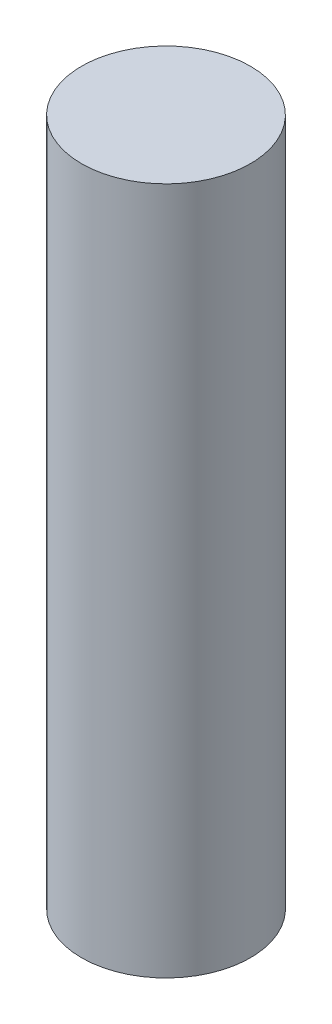
ISO-10303-21;
HEADER;
FILE_DESCRIPTION(('STEP AP214'),'2;1');
FILE_NAME('part.step','',(''),(''),'','','');
FILE_SCHEMA(('AUTOMOTIVE_DESIGN { 1 0 10303 214 1 1 1 1 }'));
ENDSEC;
DATA;
#1=APPLICATION_CONTEXT('core data for automotive mechanical design processes');
#2=APPLICATION_PROTOCOL_DEFINITION('international standard','automotive_design',2000,#1);
#3=PRODUCT_CONTEXT('',#1,'mechanical');
#4=PRODUCT('Part','Part','',(#3));
#5=PRODUCT_RELATED_PRODUCT_CATEGORY('part','',(#4));
#6=PRODUCT_DEFINITION_FORMATION('','',#4);
#7=PRODUCT_DEFINITION_CONTEXT('part definition',#1,'design');
#8=PRODUCT_DEFINITION('design','',#6,#7);
#9=PRODUCT_DEFINITION_SHAPE('','',#8);
#10=(LENGTH_UNIT() NAMED_UNIT(*) SI_UNIT(.MILLI.,.METRE.));
#11=(NAMED_UNIT(*) PLANE_ANGLE_UNIT() SI_UNIT($,.RADIAN.));
#12=(NAMED_UNIT(*) SI_UNIT($,.STERADIAN.) SOLID_ANGLE_UNIT());
#13=UNCERTAINTY_MEASURE_WITH_UNIT(LENGTH_MEASURE(1.E-05),#10,'distance_accuracy_value','');
#14=(GEOMETRIC_REPRESENTATION_CONTEXT(3) GLOBAL_UNCERTAINTY_ASSIGNED_CONTEXT((#13)) GLOBAL_UNIT_ASSIGNED_CONTEXT((#10,
#11,#12)) REPRESENTATION_CONTEXT('',''));
#15=CARTESIAN_POINT('',(0.,0.,0.));
#16=DIRECTION('',(0.,0.,1.));
#17=DIRECTION('',(1.,0.,0.));
#18=AXIS2_PLACEMENT_3D('',#15,#16,#17);
#19=CARTESIAN_POINT('',(-139.999999999997,-107.5,1687.5));
#20=DIRECTION('',(0.,-1.,0.));
#21=DIRECTION('',(0.,0.,-1.));
#22=AXIS2_PLACEMENT_3D('',#19,#20,#21);
#23=PLANE('',#22);
#24=CARTESIAN_POINT('',(-139.999999999997,-107.5,1687.5));
#25=DIRECTION('',(0.,-1.,0.));
#26=DIRECTION('',(0.,0.,-1.));
#27=AXIS2_PLACEMENT_3D('',#24,#25,#26);
#28=CIRCLE('',#27,17.5);
#29=CARTESIAN_POINT('',(-139.999999999997,-107.5,1670.));
#30=VERTEX_POINT('',#29);
#31=EDGE_CURVE('E18',#30,#30,#28,.F.);
#32=ORIENTED_EDGE('',*,*,#31,.F.);
#33=EDGE_LOOP('',(#32));
#34=FACE_BOUND('',#33,.T.);
#35=ADVANCED_FACE('F15',(#34),#23,.T.);
#36=CARTESIAN_POINT('',(-244.51322816025,35.,1798.));
#37=DIRECTION('',(0.,1.,0.));
#38=DIRECTION('',(0.,0.,1.));
#39=AXIS2_PLACEMENT_3D('',#36,#37,#38);
#40=PLANE('',#39);
#41=CARTESIAN_POINT('',(-139.999999999997,35.,1687.5));
#42=DIRECTION('',(0.,-1.,0.));
#43=DIRECTION('',(0.,0.,-1.));
#44=AXIS2_PLACEMENT_3D('',#41,#42,#43);
#45=CIRCLE('',#44,17.5);
#46=CARTESIAN_POINT('',(-139.999999999997,35.,1670.));
#47=VERTEX_POINT('',#46);
#48=EDGE_CURVE('E10',#47,#47,#45,.T.);
#49=ORIENTED_EDGE('',*,*,#48,.F.);
#50=EDGE_LOOP('',(#49));
#51=FACE_BOUND('',#50,.T.);
#52=ADVANCED_FACE('F30',(#51),#40,.T.);
#53=CARTESIAN_POINT('',(-139.999999999997,84.4974746830584,1687.5));
#54=DIRECTION('',(0.,-1.,0.));
#55=DIRECTION('',(0.,0.,-1.));
#56=AXIS2_PLACEMENT_3D('',#53,#54,#55);
#57=CYLINDRICAL_SURFACE('',#56,17.5);
#58=ORIENTED_EDGE('',*,*,#48,.T.);
#59=EDGE_LOOP('',(#58));
#60=FACE_BOUND('',#59,.T.);
#61=ORIENTED_EDGE('',*,*,#31,.T.);
#62=EDGE_LOOP('',(#61));
#63=FACE_BOUND('',#62,.T.);
#64=ADVANCED_FACE('F27',(#60,#63),#57,.T.);
#65=CLOSED_SHELL('',(#35,#52,#64));
#66=MANIFOLD_SOLID_BREP('B1',#65);
#67=ADVANCED_BREP_SHAPE_REPRESENTATION('',(#18,#66),#14);
#68=SHAPE_DEFINITION_REPRESENTATION(#9,#67);
ENDSEC;
END-ISO-10303-21;
